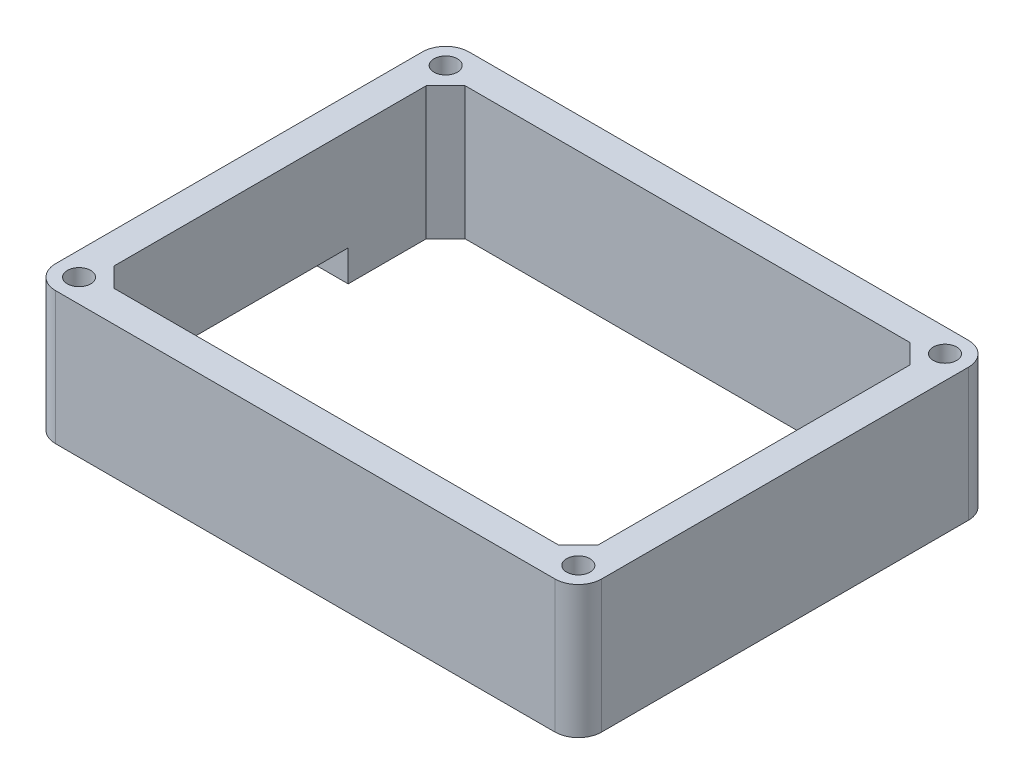
ISO-10303-21;
HEADER;
FILE_DESCRIPTION(('STEP AP214'),'2;1');
FILE_NAME('part.step','',(''),(''),'','','');
FILE_SCHEMA(('AUTOMOTIVE_DESIGN { 1 0 10303 214 1 1 1 1 }'));
ENDSEC;
DATA;
#1=APPLICATION_CONTEXT('core data for automotive mechanical design processes');
#2=APPLICATION_PROTOCOL_DEFINITION('international standard','automotive_design',2000,#1);
#3=PRODUCT_CONTEXT('',#1,'mechanical');
#4=PRODUCT('Part','Part','',(#3));
#5=PRODUCT_RELATED_PRODUCT_CATEGORY('part','',(#4));
#6=PRODUCT_DEFINITION_FORMATION('','',#4);
#7=PRODUCT_DEFINITION_CONTEXT('part definition',#1,'design');
#8=PRODUCT_DEFINITION('design','',#6,#7);
#9=PRODUCT_DEFINITION_SHAPE('','',#8);
#10=(LENGTH_UNIT() NAMED_UNIT(*) SI_UNIT(.MILLI.,.METRE.));
#11=(NAMED_UNIT(*) PLANE_ANGLE_UNIT() SI_UNIT($,.RADIAN.));
#12=(NAMED_UNIT(*) SI_UNIT($,.STERADIAN.) SOLID_ANGLE_UNIT());
#13=UNCERTAINTY_MEASURE_WITH_UNIT(LENGTH_MEASURE(1.E-05),#10,'distance_accuracy_value','');
#14=(GEOMETRIC_REPRESENTATION_CONTEXT(3) GLOBAL_UNCERTAINTY_ASSIGNED_CONTEXT((#13)) GLOBAL_UNIT_ASSIGNED_CONTEXT((#10,
#11,#12)) REPRESENTATION_CONTEXT('',''));
#15=CARTESIAN_POINT('',(0.,0.,0.));
#16=DIRECTION('',(0.,0.,1.));
#17=DIRECTION('',(1.,0.,0.));
#18=AXIS2_PLACEMENT_3D('',#15,#16,#17);
#19=CARTESIAN_POINT('',(-67.,17.,-2.99999999999999));
#20=DIRECTION('',(0.,-1.,0.));
#21=DIRECTION('',(0.,0.,-1.));
#22=AXIS2_PLACEMENT_3D('',#19,#20,#21);
#23=PLANE('',#22);
#24=CARTESIAN_POINT('',(-67.,17.,-2.99999999999999));
#25=DIRECTION('',(0.,1.,0.));
#26=DIRECTION('',(0.,0.,-1.));
#27=AXIS2_PLACEMENT_3D('',#24,#25,#26);
#28=CIRCLE('',#27,1.5);
#29=CARTESIAN_POINT('',(-67.,17.,-4.49999999999999));
#30=VERTEX_POINT('',#29);
#31=EDGE_CURVE('E269',#30,#30,#28,.T.);
#32=ORIENTED_EDGE('',*,*,#31,.F.);
#33=EDGE_LOOP('',(#32));
#34=FACE_BOUND('',#33,.T.);
#35=CARTESIAN_POINT('',(-3.,17.,-3.));
#36=DIRECTION('',(0.,1.,0.));
#37=DIRECTION('',(0.,0.,1.));
#38=AXIS2_PLACEMENT_3D('',#35,#36,#37);
#39=CIRCLE('',#38,1.5);
#40=CARTESIAN_POINT('',(-3.,17.,-1.5));
#41=VERTEX_POINT('',#40);
#42=EDGE_CURVE('E277',#41,#41,#39,.T.);
#43=ORIENTED_EDGE('',*,*,#42,.F.);
#44=EDGE_LOOP('',(#43));
#45=FACE_BOUND('',#44,.T.);
#46=CARTESIAN_POINT('',(-3.,17.,-50.));
#47=DIRECTION('',(0.,1.,0.));
#48=DIRECTION('',(0.,0.,-1.));
#49=AXIS2_PLACEMENT_3D('',#46,#47,#48);
#50=CIRCLE('',#49,1.5);
#51=CARTESIAN_POINT('',(-3.,17.,-51.5));
#52=VERTEX_POINT('',#51);
#53=EDGE_CURVE('E285',#52,#52,#50,.T.);
#54=ORIENTED_EDGE('',*,*,#53,.F.);
#55=EDGE_LOOP('',(#54));
#56=FACE_BOUND('',#55,.T.);
#57=CARTESIAN_POINT('',(-67.,17.,-50.));
#58=DIRECTION('',(0.,1.,0.));
#59=DIRECTION('',(0.,0.,1.));
#60=AXIS2_PLACEMENT_3D('',#57,#58,#59);
#61=CIRCLE('',#60,1.5);
#62=CARTESIAN_POINT('',(-67.,17.,-48.5));
#63=VERTEX_POINT('',#62);
#64=EDGE_CURVE('E293',#63,#63,#61,.T.);
#65=ORIENTED_EDGE('',*,*,#64,.F.);
#66=EDGE_LOOP('',(#65));
#67=FACE_BOUND('',#66,.T.);
#68=CARTESIAN_POINT('',(-67.,17.,-2.99999999999999));
#69=DIRECTION('',(0.,1.,0.));
#70=DIRECTION('',(0.,0.,-1.));
#71=AXIS2_PLACEMENT_3D('',#68,#69,#70);
#72=CIRCLE('',#71,3.);
#73=CARTESIAN_POINT('',(-70.,17.,-3.00000000000001));
#74=VERTEX_POINT('',#73);
#75=CARTESIAN_POINT('',(-67.,17.,0.));
#76=VERTEX_POINT('',#75);
#77=EDGE_CURVE('E301',#74,#76,#72,.T.);
#78=ORIENTED_EDGE('',*,*,#77,.T.);
#79=DIRECTION('',(1.,0.,0.));
#80=VECTOR('',#79,1.);
#81=CARTESIAN_POINT('',(-3.00000000000002,17.,0.));
#82=LINE('',#81,#80);
#83=CARTESIAN_POINT('',(-3.00000000000002,17.,0.));
#84=VERTEX_POINT('',#83);
#85=EDGE_CURVE('E305',#76,#84,#82,.T.);
#86=ORIENTED_EDGE('',*,*,#85,.T.);
#87=CARTESIAN_POINT('',(-3.,17.,-3.));
#88=DIRECTION('',(0.,1.,0.));
#89=DIRECTION('',(0.,0.,1.));
#90=AXIS2_PLACEMENT_3D('',#87,#88,#89);
#91=CIRCLE('',#90,3.);
#92=CARTESIAN_POINT('',(0.,17.,-3.00000000000002));
#93=VERTEX_POINT('',#92);
#94=EDGE_CURVE('E309',#84,#93,#91,.T.);
#95=ORIENTED_EDGE('',*,*,#94,.T.);
#96=DIRECTION('',(0.,0.,-1.));
#97=VECTOR('',#96,1.);
#98=CARTESIAN_POINT('',(0.,17.,-3.00000000000002));
#99=LINE('',#98,#97);
#100=CARTESIAN_POINT('',(0.,17.,-50.));
#101=VERTEX_POINT('',#100);
#102=EDGE_CURVE('E312',#93,#101,#99,.T.);
#103=ORIENTED_EDGE('',*,*,#102,.T.);
#104=CARTESIAN_POINT('',(-3.,17.,-50.));
#105=DIRECTION('',(0.,1.,0.));
#106=DIRECTION('',(0.,0.,1.));
#107=AXIS2_PLACEMENT_3D('',#104,#105,#106);
#108=CIRCLE('',#107,3.);
#109=CARTESIAN_POINT('',(-3.00000000000002,17.,-53.));
#110=VERTEX_POINT('',#109);
#111=EDGE_CURVE('E315',#101,#110,#108,.T.);
#112=ORIENTED_EDGE('',*,*,#111,.T.);
#113=DIRECTION('',(-1.,0.,0.));
#114=VECTOR('',#113,1.);
#115=CARTESIAN_POINT('',(-3.00000000000002,17.,-53.));
#116=LINE('',#115,#114);
#117=CARTESIAN_POINT('',(-67.,17.,-53.));
#118=VERTEX_POINT('',#117);
#119=EDGE_CURVE('E318',#110,#118,#116,.T.);
#120=ORIENTED_EDGE('',*,*,#119,.T.);
#121=CARTESIAN_POINT('',(-67.,17.,-50.));
#122=DIRECTION('',(0.,1.,0.));
#123=DIRECTION('',(0.,0.,1.));
#124=AXIS2_PLACEMENT_3D('',#121,#122,#123);
#125=CIRCLE('',#124,3.);
#126=CARTESIAN_POINT('',(-70.,17.,-50.));
#127=VERTEX_POINT('',#126);
#128=EDGE_CURVE('E321',#118,#127,#125,.T.);
#129=ORIENTED_EDGE('',*,*,#128,.T.);
#130=DIRECTION('',(0.,0.,1.));
#131=VECTOR('',#130,1.);
#132=CARTESIAN_POINT('',(-70.,17.,-3.00000000000001));
#133=LINE('',#132,#131);
#134=EDGE_CURVE('E324',#127,#74,#133,.T.);
#135=ORIENTED_EDGE('',*,*,#134,.T.);
#136=EDGE_LOOP('',(#78,#86,#95,#103,#112,#120,#129,#135));
#137=FACE_BOUND('',#136,.T.);
#138=DIRECTION('',(-1.,0.,0.));
#139=VECTOR('',#138,1.);
#140=CARTESIAN_POINT('',(-63.5,17.,-49.));
#141=LINE('',#140,#139);
#142=CARTESIAN_POINT('',(-6.5,17.,-49.));
#143=VERTEX_POINT('',#142);
#144=CARTESIAN_POINT('',(-63.5,17.,-49.));
#145=VERTEX_POINT('',#144);
#146=EDGE_CURVE('E242',#143,#145,#141,.T.);
#147=ORIENTED_EDGE('',*,*,#146,.F.);
#148=DIRECTION('',(-0.707106781186547,0.,-0.707106781186548));
#149=VECTOR('',#148,1.);
#150=CARTESIAN_POINT('',(-6.5,17.,-49.));
#151=LINE('',#150,#149);
#152=CARTESIAN_POINT('',(-4.00000000000001,17.,-46.5));
#153=VERTEX_POINT('',#152);
#154=EDGE_CURVE('E247',#153,#143,#151,.T.);
#155=ORIENTED_EDGE('',*,*,#154,.F.);
#156=DIRECTION('',(0.,0.,-1.));
#157=VECTOR('',#156,1.);
#158=CARTESIAN_POINT('',(-4.,17.,-46.5));
#159=LINE('',#158,#157);
#160=CARTESIAN_POINT('',(-4.,17.,-6.5));
#161=VERTEX_POINT('',#160);
#162=EDGE_CURVE('E411',#161,#153,#159,.T.);
#163=ORIENTED_EDGE('',*,*,#162,.F.);
#164=DIRECTION('',(0.707106781186548,0.,-0.707106781186548));
#165=VECTOR('',#164,1.);
#166=CARTESIAN_POINT('',(-6.5,17.,-4.));
#167=LINE('',#166,#165);
#168=CARTESIAN_POINT('',(-6.5,17.,-4.));
#169=VERTEX_POINT('',#168);
#170=EDGE_CURVE('E414',#169,#161,#167,.T.);
#171=ORIENTED_EDGE('',*,*,#170,.F.);
#172=DIRECTION('',(1.,0.,0.));
#173=VECTOR('',#172,1.);
#174=CARTESIAN_POINT('',(-63.5,17.,-4.));
#175=LINE('',#174,#173);
#176=CARTESIAN_POINT('',(-63.5,17.,-4.));
#177=VERTEX_POINT('',#176);
#178=EDGE_CURVE('E417',#177,#169,#175,.T.);
#179=ORIENTED_EDGE('',*,*,#178,.F.);
#180=DIRECTION('',(0.707106781186548,0.,0.707106781186547));
#181=VECTOR('',#180,1.);
#182=CARTESIAN_POINT('',(-66.,17.,-6.5));
#183=LINE('',#182,#181);
#184=CARTESIAN_POINT('',(-66.,17.,-6.5));
#185=VERTEX_POINT('',#184);
#186=EDGE_CURVE('E420',#185,#177,#183,.T.);
#187=ORIENTED_EDGE('',*,*,#186,.F.);
#188=DIRECTION('',(0.,0.,1.));
#189=VECTOR('',#188,1.);
#190=CARTESIAN_POINT('',(-66.,17.,-46.5));
#191=LINE('',#190,#189);
#192=CARTESIAN_POINT('',(-66.,17.,-46.5));
#193=VERTEX_POINT('',#192);
#194=EDGE_CURVE('E423',#193,#185,#191,.T.);
#195=ORIENTED_EDGE('',*,*,#194,.F.);
#196=DIRECTION('',(-0.707106781186547,0.,0.707106781186547));
#197=VECTOR('',#196,1.);
#198=CARTESIAN_POINT('',(-66.,17.,-46.5));
#199=LINE('',#198,#197);
#200=EDGE_CURVE('E426',#145,#193,#199,.T.);
#201=ORIENTED_EDGE('',*,*,#200,.F.);
#202=EDGE_LOOP('',(#147,#155,#163,#171,#179,#187,#195,#201));
#203=FACE_BOUND('',#202,.T.);
#204=ADVANCED_FACE('F45',(#34,#45,#56,#67,#137,#203),#23,.F.);
#205=CARTESIAN_POINT('',(-67.,0.,-2.99999999999999));
#206=DIRECTION('',(0.,-1.,0.));
#207=DIRECTION('',(0.,0.,-1.));
#208=AXIS2_PLACEMENT_3D('',#205,#206,#207);
#209=PLANE('',#208);
#210=DIRECTION('',(-1.,0.,0.));
#211=VECTOR('',#210,1.);
#212=CARTESIAN_POINT('',(-45.6039219456289,0.,-16.5));
#213=LINE('',#212,#211);
#214=CARTESIAN_POINT('',(-66.,0.,-16.5));
#215=VERTEX_POINT('',#214);
#216=CARTESIAN_POINT('',(-70.,0.,-16.5));
#217=VERTEX_POINT('',#216);
#218=EDGE_CURVE('E187',#215,#217,#213,.T.);
#219=ORIENTED_EDGE('',*,*,#218,.F.);
#220=DIRECTION('',(0.,0.,1.));
#221=VECTOR('',#220,1.);
#222=CARTESIAN_POINT('',(-66.,0.,-46.5));
#223=LINE('',#222,#221);
#224=CARTESIAN_POINT('',(-66.,0.,-6.5));
#225=VERTEX_POINT('',#224);
#226=EDGE_CURVE('E200',#215,#225,#223,.T.);
#227=ORIENTED_EDGE('',*,*,#226,.T.);
#228=DIRECTION('',(0.707106781186548,0.,0.707106781186547));
#229=VECTOR('',#228,1.);
#230=CARTESIAN_POINT('',(-66.,0.,-6.5));
#231=LINE('',#230,#229);
#232=CARTESIAN_POINT('',(-63.5,0.,-4.));
#233=VERTEX_POINT('',#232);
#234=EDGE_CURVE('E218',#225,#233,#231,.T.);
#235=ORIENTED_EDGE('',*,*,#234,.T.);
#236=DIRECTION('',(1.,0.,0.));
#237=VECTOR('',#236,1.);
#238=CARTESIAN_POINT('',(-63.5,0.,-4.));
#239=LINE('',#238,#237);
#240=CARTESIAN_POINT('',(-6.5,0.,-4.));
#241=VERTEX_POINT('',#240);
#242=EDGE_CURVE('E226',#233,#241,#239,.T.);
#243=ORIENTED_EDGE('',*,*,#242,.T.);
#244=DIRECTION('',(0.707106781186548,0.,-0.707106781186548));
#245=VECTOR('',#244,1.);
#246=CARTESIAN_POINT('',(-6.5,0.,-4.));
#247=LINE('',#246,#245);
#248=CARTESIAN_POINT('',(-4.,0.,-6.5));
#249=VERTEX_POINT('',#248);
#250=EDGE_CURVE('E230',#241,#249,#247,.T.);
#251=ORIENTED_EDGE('',*,*,#250,.T.);
#252=DIRECTION('',(0.,0.,-1.));
#253=VECTOR('',#252,1.);
#254=CARTESIAN_POINT('',(-4.,0.,-46.5));
#255=LINE('',#254,#253);
#256=CARTESIAN_POINT('',(-4.,0.,-46.5));
#257=VERTEX_POINT('',#256);
#258=EDGE_CURVE('E234',#249,#257,#255,.T.);
#259=ORIENTED_EDGE('',*,*,#258,.T.);
#260=DIRECTION('',(-0.707106781186547,0.,-0.707106781186548));
#261=VECTOR('',#260,1.);
#262=CARTESIAN_POINT('',(-6.5,0.,-49.));
#263=LINE('',#262,#261);
#264=CARTESIAN_POINT('',(-6.50000000000001,0.,-49.));
#265=VERTEX_POINT('',#264);
#266=EDGE_CURVE('E238',#257,#265,#263,.T.);
#267=ORIENTED_EDGE('',*,*,#266,.T.);
#268=DIRECTION('',(-1.,0.,0.));
#269=VECTOR('',#268,1.);
#270=CARTESIAN_POINT('',(-63.5,0.,-49.));
#271=LINE('',#270,#269);
#272=CARTESIAN_POINT('',(-63.5,0.,-49.));
#273=VERTEX_POINT('',#272);
#274=EDGE_CURVE('E220',#265,#273,#271,.T.);
#275=ORIENTED_EDGE('',*,*,#274,.T.);
#276=DIRECTION('',(-0.707106781186547,0.,0.707106781186547));
#277=VECTOR('',#276,1.);
#278=CARTESIAN_POINT('',(-66.,0.,-46.5));
#279=LINE('',#278,#277);
#280=CARTESIAN_POINT('',(-66.,0.,-46.5));
#281=VERTEX_POINT('',#280);
#282=EDGE_CURVE('E213',#273,#281,#279,.T.);
#283=ORIENTED_EDGE('',*,*,#282,.T.);
#284=CARTESIAN_POINT('',(-66.,0.,-36.5));
#285=VERTEX_POINT('',#284);
#286=EDGE_CURVE('E212',#281,#285,#223,.T.);
#287=ORIENTED_EDGE('',*,*,#286,.T.);
#288=DIRECTION('',(-1.,0.,0.));
#289=VECTOR('',#288,1.);
#290=CARTESIAN_POINT('',(-45.6039219456289,0.,-36.5));
#291=LINE('',#290,#289);
#292=CARTESIAN_POINT('',(-70.,0.,-36.5));
#293=VERTEX_POINT('',#292);
#294=EDGE_CURVE('E61',#285,#293,#291,.T.);
#295=ORIENTED_EDGE('',*,*,#294,.T.);
#296=DIRECTION('',(0.,0.,1.));
#297=VECTOR('',#296,1.);
#298=CARTESIAN_POINT('',(-70.,0.,-3.00000000000001));
#299=LINE('',#298,#297);
#300=CARTESIAN_POINT('',(-70.,0.,-50.));
#301=VERTEX_POINT('',#300);
#302=EDGE_CURVE('E306',#301,#293,#299,.T.);
#303=ORIENTED_EDGE('',*,*,#302,.F.);
#304=CARTESIAN_POINT('',(-67.,0.,-50.));
#305=DIRECTION('',(0.,1.,0.));
#306=DIRECTION('',(0.,0.,1.));
#307=AXIS2_PLACEMENT_3D('',#304,#305,#306);
#308=CIRCLE('',#307,3.);
#309=CARTESIAN_POINT('',(-67.,0.,-53.));
#310=VERTEX_POINT('',#309);
#311=EDGE_CURVE('E346',#310,#301,#308,.T.);
#312=ORIENTED_EDGE('',*,*,#311,.F.);
#313=DIRECTION('',(-1.,0.,0.));
#314=VECTOR('',#313,1.);
#315=CARTESIAN_POINT('',(-3.00000000000002,0.,-53.));
#316=LINE('',#315,#314);
#317=CARTESIAN_POINT('',(-3.00000000000002,0.,-53.));
#318=VERTEX_POINT('',#317);
#319=EDGE_CURVE('E343',#318,#310,#316,.T.);
#320=ORIENTED_EDGE('',*,*,#319,.F.);
#321=CARTESIAN_POINT('',(-3.,0.,-50.));
#322=DIRECTION('',(0.,1.,0.));
#323=DIRECTION('',(0.,0.,1.));
#324=AXIS2_PLACEMENT_3D('',#321,#322,#323);
#325=CIRCLE('',#324,3.);
#326=CARTESIAN_POINT('',(0.,0.,-50.));
#327=VERTEX_POINT('',#326);
#328=EDGE_CURVE('E340',#327,#318,#325,.T.);
#329=ORIENTED_EDGE('',*,*,#328,.F.);
#330=DIRECTION('',(0.,0.,-1.));
#331=VECTOR('',#330,1.);
#332=CARTESIAN_POINT('',(0.,0.,-3.00000000000002));
#333=LINE('',#332,#331);
#334=CARTESIAN_POINT('',(0.,0.,-3.00000000000002));
#335=VERTEX_POINT('',#334);
#336=EDGE_CURVE('E337',#335,#327,#333,.T.);
#337=ORIENTED_EDGE('',*,*,#336,.F.);
#338=CARTESIAN_POINT('',(-3.,0.,-3.));
#339=DIRECTION('',(0.,1.,0.));
#340=DIRECTION('',(0.,0.,1.));
#341=AXIS2_PLACEMENT_3D('',#338,#339,#340);
#342=CIRCLE('',#341,3.);
#343=CARTESIAN_POINT('',(-3.00000000000002,0.,0.));
#344=VERTEX_POINT('',#343);
#345=EDGE_CURVE('E334',#344,#335,#342,.T.);
#346=ORIENTED_EDGE('',*,*,#345,.F.);
#347=DIRECTION('',(1.,0.,0.));
#348=VECTOR('',#347,1.);
#349=CARTESIAN_POINT('',(-3.00000000000002,0.,0.));
#350=LINE('',#349,#348);
#351=CARTESIAN_POINT('',(-67.,0.,0.));
#352=VERTEX_POINT('',#351);
#353=EDGE_CURVE('E331',#352,#344,#350,.T.);
#354=ORIENTED_EDGE('',*,*,#353,.F.);
#355=CARTESIAN_POINT('',(-67.,0.,-2.99999999999999));
#356=DIRECTION('',(0.,1.,0.));
#357=DIRECTION('',(0.,0.,-1.));
#358=AXIS2_PLACEMENT_3D('',#355,#356,#357);
#359=CIRCLE('',#358,3.);
#360=CARTESIAN_POINT('',(-70.,0.,-3.00000000000001));
#361=VERTEX_POINT('',#360);
#362=EDGE_CURVE('E297',#361,#352,#359,.T.);
#363=ORIENTED_EDGE('',*,*,#362,.F.);
#364=EDGE_CURVE('E203',#217,#361,#299,.T.);
#365=ORIENTED_EDGE('',*,*,#364,.F.);
#366=EDGE_LOOP('',(#219,#227,#235,#243,#251,#259,#267,#275,#283,#287,#295,#303,#312,#320,#329,
#337,#346,#354,#363,#365));
#367=FACE_BOUND('',#366,.T.);
#368=CARTESIAN_POINT('',(-3.,0.,-3.));
#369=DIRECTION('',(0.,1.,0.));
#370=DIRECTION('',(0.,0.,1.));
#371=AXIS2_PLACEMENT_3D('',#368,#369,#370);
#372=CIRCLE('',#371,1.5);
#373=CARTESIAN_POINT('',(-3.,0.,-1.5));
#374=VERTEX_POINT('',#373);
#375=EDGE_CURVE('E273',#374,#374,#372,.T.);
#376=ORIENTED_EDGE('',*,*,#375,.T.);
#377=EDGE_LOOP('',(#376));
#378=FACE_BOUND('',#377,.T.);
#379=CARTESIAN_POINT('',(-67.,0.,-50.));
#380=DIRECTION('',(0.,1.,0.));
#381=DIRECTION('',(0.,0.,1.));
#382=AXIS2_PLACEMENT_3D('',#379,#380,#381);
#383=CIRCLE('',#382,1.5);
#384=CARTESIAN_POINT('',(-67.,0.,-48.5));
#385=VERTEX_POINT('',#384);
#386=EDGE_CURVE('E289',#385,#385,#383,.T.);
#387=ORIENTED_EDGE('',*,*,#386,.T.);
#388=EDGE_LOOP('',(#387));
#389=FACE_BOUND('',#388,.T.);
#390=CARTESIAN_POINT('',(-3.,0.,-50.));
#391=DIRECTION('',(0.,1.,0.));
#392=DIRECTION('',(0.,0.,-1.));
#393=AXIS2_PLACEMENT_3D('',#390,#391,#392);
#394=CIRCLE('',#393,1.5);
#395=CARTESIAN_POINT('',(-3.,0.,-51.5));
#396=VERTEX_POINT('',#395);
#397=EDGE_CURVE('E281',#396,#396,#394,.T.);
#398=ORIENTED_EDGE('',*,*,#397,.T.);
#399=EDGE_LOOP('',(#398));
#400=FACE_BOUND('',#399,.T.);
#401=CARTESIAN_POINT('',(-67.,0.,-2.99999999999999));
#402=DIRECTION('',(0.,1.,0.));
#403=DIRECTION('',(0.,0.,-1.));
#404=AXIS2_PLACEMENT_3D('',#401,#402,#403);
#405=CIRCLE('',#404,1.5);
#406=CARTESIAN_POINT('',(-67.,0.,-4.49999999999999));
#407=VERTEX_POINT('',#406);
#408=EDGE_CURVE('E268',#407,#407,#405,.T.);
#409=ORIENTED_EDGE('',*,*,#408,.T.);
#410=EDGE_LOOP('',(#409));
#411=FACE_BOUND('',#410,.T.);
#412=ADVANCED_FACE('F197',(#367,#378,#389,#400,#411),#209,.T.);
#413=CARTESIAN_POINT('',(-67.,17.,-2.99999999999999));
#414=DIRECTION('',(0.,-1.,0.));
#415=DIRECTION('',(0.,0.,-1.));
#416=AXIS2_PLACEMENT_3D('',#413,#414,#415);
#417=CYLINDRICAL_SURFACE('',#416,3.);
#418=ORIENTED_EDGE('',*,*,#362,.T.);
#419=DIRECTION('',(0.,-1.,0.));
#420=VECTOR('',#419,1.);
#421=CARTESIAN_POINT('',(-67.,17.,0.));
#422=LINE('',#421,#420);
#423=EDGE_CURVE('E11',#76,#352,#422,.T.);
#424=ORIENTED_EDGE('',*,*,#423,.F.);
#425=ORIENTED_EDGE('',*,*,#77,.F.);
#426=DIRECTION('',(0.,-1.,0.));
#427=VECTOR('',#426,1.);
#428=CARTESIAN_POINT('',(-70.,17.,-3.00000000000001));
#429=LINE('',#428,#427);
#430=EDGE_CURVE('E327',#74,#361,#429,.T.);
#431=ORIENTED_EDGE('',*,*,#430,.T.);
#432=EDGE_LOOP('',(#418,#424,#425,#431));
#433=FACE_BOUND('',#432,.T.);
#434=ADVANCED_FACE('F47',(#433),#417,.T.);
#435=CARTESIAN_POINT('',(-3.00000000000002,17.,0.));
#436=DIRECTION('',(0.,0.,-1.));
#437=DIRECTION('',(-1.,0.,0.));
#438=AXIS2_PLACEMENT_3D('',#435,#436,#437);
#439=PLANE('',#438);
#440=ORIENTED_EDGE('',*,*,#353,.T.);
#441=DIRECTION('',(0.,-1.,0.));
#442=VECTOR('',#441,1.);
#443=CARTESIAN_POINT('',(-3.00000000000002,17.,0.));
#444=LINE('',#443,#442);
#445=EDGE_CURVE('E54',#84,#344,#444,.T.);
#446=ORIENTED_EDGE('',*,*,#445,.F.);
#447=ORIENTED_EDGE('',*,*,#85,.F.);
#448=ORIENTED_EDGE('',*,*,#423,.T.);
#449=EDGE_LOOP('',(#440,#446,#447,#448));
#450=FACE_BOUND('',#449,.T.);
#451=ADVANCED_FACE('F400',(#450),#439,.F.);
#452=CARTESIAN_POINT('',(-3.,17.,-3.));
#453=DIRECTION('',(0.,-1.,0.));
#454=DIRECTION('',(0.,0.,-1.));
#455=AXIS2_PLACEMENT_3D('',#452,#453,#454);
#456=CYLINDRICAL_SURFACE('',#455,3.);
#457=ORIENTED_EDGE('',*,*,#345,.T.);
#458=DIRECTION('',(0.,-1.,0.));
#459=VECTOR('',#458,1.);
#460=CARTESIAN_POINT('',(0.,17.,-3.00000000000002));
#461=LINE('',#460,#459);
#462=EDGE_CURVE('E371',#93,#335,#461,.T.);
#463=ORIENTED_EDGE('',*,*,#462,.F.);
#464=ORIENTED_EDGE('',*,*,#94,.F.);
#465=ORIENTED_EDGE('',*,*,#445,.T.);
#466=EDGE_LOOP('',(#457,#463,#464,#465));
#467=FACE_BOUND('',#466,.T.);
#468=ADVANCED_FACE('F380',(#467),#456,.T.);
#469=CARTESIAN_POINT('',(0.,17.,-3.00000000000002));
#470=DIRECTION('',(-1.,0.,0.));
#471=DIRECTION('',(0.,0.,1.));
#472=AXIS2_PLACEMENT_3D('',#469,#470,#471);
#473=PLANE('',#472);
#474=ORIENTED_EDGE('',*,*,#336,.T.);
#475=DIRECTION('',(0.,-1.,0.));
#476=VECTOR('',#475,1.);
#477=CARTESIAN_POINT('',(0.,17.,-50.));
#478=LINE('',#477,#476);
#479=EDGE_CURVE('E367',#101,#327,#478,.T.);
#480=ORIENTED_EDGE('',*,*,#479,.F.);
#481=ORIENTED_EDGE('',*,*,#102,.F.);
#482=ORIENTED_EDGE('',*,*,#462,.T.);
#483=EDGE_LOOP('',(#474,#480,#481,#482));
#484=FACE_BOUND('',#483,.T.);
#485=ADVANCED_FACE('F388',(#484),#473,.F.);
#486=CARTESIAN_POINT('',(-3.,17.,-50.));
#487=DIRECTION('',(0.,-1.,0.));
#488=DIRECTION('',(0.,0.,-1.));
#489=AXIS2_PLACEMENT_3D('',#486,#487,#488);
#490=CYLINDRICAL_SURFACE('',#489,3.);
#491=ORIENTED_EDGE('',*,*,#328,.T.);
#492=DIRECTION('',(0.,-1.,0.));
#493=VECTOR('',#492,1.);
#494=CARTESIAN_POINT('',(-3.00000000000002,17.,-53.));
#495=LINE('',#494,#493);
#496=EDGE_CURVE('E363',#110,#318,#495,.T.);
#497=ORIENTED_EDGE('',*,*,#496,.F.);
#498=ORIENTED_EDGE('',*,*,#111,.F.);
#499=ORIENTED_EDGE('',*,*,#479,.T.);
#500=EDGE_LOOP('',(#491,#497,#498,#499));
#501=FACE_BOUND('',#500,.T.);
#502=ADVANCED_FACE('F392',(#501),#490,.T.);
#503=CARTESIAN_POINT('',(-3.00000000000002,17.,-53.));
#504=DIRECTION('',(0.,0.,1.));
#505=DIRECTION('',(1.,0.,0.));
#506=AXIS2_PLACEMENT_3D('',#503,#504,#505);
#507=PLANE('',#506);
#508=ORIENTED_EDGE('',*,*,#319,.T.);
#509=DIRECTION('',(0.,-1.,0.));
#510=VECTOR('',#509,1.);
#511=CARTESIAN_POINT('',(-67.,17.,-53.));
#512=LINE('',#511,#510);
#513=EDGE_CURVE('E359',#118,#310,#512,.T.);
#514=ORIENTED_EDGE('',*,*,#513,.F.);
#515=ORIENTED_EDGE('',*,*,#119,.F.);
#516=ORIENTED_EDGE('',*,*,#496,.T.);
#517=EDGE_LOOP('',(#508,#514,#515,#516));
#518=FACE_BOUND('',#517,.T.);
#519=ADVANCED_FACE('F490',(#518),#507,.F.);
#520=CARTESIAN_POINT('',(-67.,17.,-50.));
#521=DIRECTION('',(0.,-1.,0.));
#522=DIRECTION('',(0.,0.,-1.));
#523=AXIS2_PLACEMENT_3D('',#520,#521,#522);
#524=CYLINDRICAL_SURFACE('',#523,3.);
#525=ORIENTED_EDGE('',*,*,#311,.T.);
#526=DIRECTION('',(0.,-1.,0.));
#527=VECTOR('',#526,1.);
#528=CARTESIAN_POINT('',(-70.,17.,-50.));
#529=LINE('',#528,#527);
#530=EDGE_CURVE('E355',#127,#301,#529,.T.);
#531=ORIENTED_EDGE('',*,*,#530,.F.);
#532=ORIENTED_EDGE('',*,*,#128,.F.);
#533=ORIENTED_EDGE('',*,*,#513,.T.);
#534=EDGE_LOOP('',(#525,#531,#532,#533));
#535=FACE_BOUND('',#534,.T.);
#536=ADVANCED_FACE('F487',(#535),#524,.T.);
#537=CARTESIAN_POINT('',(-70.,17.,-3.00000000000001));
#538=DIRECTION('',(1.,0.,0.));
#539=DIRECTION('',(0.,0.,-1.));
#540=AXIS2_PLACEMENT_3D('',#537,#538,#539);
#541=PLANE('',#540);
#542=DIRECTION('',(0.,0.,-1.));
#543=VECTOR('',#542,1.);
#544=CARTESIAN_POINT('',(-70.,4.,-36.5));
#545=LINE('',#544,#543);
#546=CARTESIAN_POINT('',(-70.,4.,-16.5));
#547=VERTEX_POINT('',#546);
#548=CARTESIAN_POINT('',(-70.,4.,-36.5));
#549=VERTEX_POINT('',#548);
#550=EDGE_CURVE('E205',#547,#549,#545,.T.);
#551=ORIENTED_EDGE('',*,*,#550,.F.);
#552=DIRECTION('',(0.,1.,0.));
#553=VECTOR('',#552,1.);
#554=CARTESIAN_POINT('',(-70.,0.,-16.5));
#555=LINE('',#554,#553);
#556=EDGE_CURVE('E407',#217,#547,#555,.T.);
#557=ORIENTED_EDGE('',*,*,#556,.F.);
#558=ORIENTED_EDGE('',*,*,#364,.T.);
#559=ORIENTED_EDGE('',*,*,#430,.F.);
#560=ORIENTED_EDGE('',*,*,#134,.F.);
#561=ORIENTED_EDGE('',*,*,#530,.T.);
#562=ORIENTED_EDGE('',*,*,#302,.T.);
#563=DIRECTION('',(0.,-1.,0.));
#564=VECTOR('',#563,1.);
#565=CARTESIAN_POINT('',(-70.,0.,-36.5));
#566=LINE('',#565,#564);
#567=EDGE_CURVE('E450',#549,#293,#566,.T.);
#568=ORIENTED_EDGE('',*,*,#567,.F.);
#569=EDGE_LOOP('',(#551,#557,#558,#559,#560,#561,#562,#568));
#570=FACE_BOUND('',#569,.T.);
#571=ADVANCED_FACE('F406',(#570),#541,.F.);
#572=CARTESIAN_POINT('',(-67.,17.,-50.));
#573=DIRECTION('',(0.,-1.,0.));
#574=DIRECTION('',(0.,0.,-1.));
#575=AXIS2_PLACEMENT_3D('',#572,#573,#574);
#576=CYLINDRICAL_SURFACE('',#575,1.5);
#577=ORIENTED_EDGE('',*,*,#64,.T.);
#578=EDGE_LOOP('',(#577));
#579=FACE_BOUND('',#578,.T.);
#580=ORIENTED_EDGE('',*,*,#386,.F.);
#581=EDGE_LOOP('',(#580));
#582=FACE_BOUND('',#581,.T.);
#583=ADVANCED_FACE('F482',(#579,#582),#576,.F.);
#584=CARTESIAN_POINT('',(-3.,17.,-50.));
#585=DIRECTION('',(0.,-1.,0.));
#586=DIRECTION('',(0.,0.,-1.));
#587=AXIS2_PLACEMENT_3D('',#584,#585,#586);
#588=CYLINDRICAL_SURFACE('',#587,1.5);
#589=ORIENTED_EDGE('',*,*,#53,.T.);
#590=EDGE_LOOP('',(#589));
#591=FACE_BOUND('',#590,.T.);
#592=ORIENTED_EDGE('',*,*,#397,.F.);
#593=EDGE_LOOP('',(#592));
#594=FACE_BOUND('',#593,.T.);
#595=ADVANCED_FACE('F560',(#591,#594),#588,.F.);
#596=CARTESIAN_POINT('',(-3.,17.,-3.));
#597=DIRECTION('',(0.,-1.,0.));
#598=DIRECTION('',(0.,0.,-1.));
#599=AXIS2_PLACEMENT_3D('',#596,#597,#598);
#600=CYLINDRICAL_SURFACE('',#599,1.5);
#601=ORIENTED_EDGE('',*,*,#42,.T.);
#602=EDGE_LOOP('',(#601));
#603=FACE_BOUND('',#602,.T.);
#604=ORIENTED_EDGE('',*,*,#375,.F.);
#605=EDGE_LOOP('',(#604));
#606=FACE_BOUND('',#605,.T.);
#607=ADVANCED_FACE('F569',(#603,#606),#600,.F.);
#608=CARTESIAN_POINT('',(-67.,17.,-2.99999999999999));
#609=DIRECTION('',(0.,-1.,0.));
#610=DIRECTION('',(0.,0.,-1.));
#611=AXIS2_PLACEMENT_3D('',#608,#609,#610);
#612=CYLINDRICAL_SURFACE('',#611,1.5);
#613=ORIENTED_EDGE('',*,*,#31,.T.);
#614=EDGE_LOOP('',(#613));
#615=FACE_BOUND('',#614,.T.);
#616=ORIENTED_EDGE('',*,*,#408,.F.);
#617=EDGE_LOOP('',(#616));
#618=FACE_BOUND('',#617,.T.);
#619=ADVANCED_FACE('F578',(#615,#618),#612,.F.);
#620=CARTESIAN_POINT('',(-63.5,17.,-49.));
#621=DIRECTION('',(0.,0.,1.));
#622=DIRECTION('',(1.,0.,0.));
#623=AXIS2_PLACEMENT_3D('',#620,#621,#622);
#624=PLANE('',#623);
#625=ORIENTED_EDGE('',*,*,#274,.F.);
#626=DIRECTION('',(0.,-1.,0.));
#627=VECTOR('',#626,1.);
#628=CARTESIAN_POINT('',(-6.5,17.,-49.));
#629=LINE('',#628,#627);
#630=EDGE_CURVE('E243',#143,#265,#629,.T.);
#631=ORIENTED_EDGE('',*,*,#630,.F.);
#632=ORIENTED_EDGE('',*,*,#146,.T.);
#633=DIRECTION('',(0.,-1.,0.));
#634=VECTOR('',#633,1.);
#635=CARTESIAN_POINT('',(-63.5,17.,-49.));
#636=LINE('',#635,#634);
#637=EDGE_CURVE('E264',#145,#273,#636,.T.);
#638=ORIENTED_EDGE('',*,*,#637,.T.);
#639=EDGE_LOOP('',(#625,#631,#632,#638));
#640=FACE_BOUND('',#639,.T.);
#641=ADVANCED_FACE('F588',(#640),#624,.T.);
#642=CARTESIAN_POINT('',(-66.,17.,-46.5));
#643=DIRECTION('',(0.707106781186548,0.,0.707106781186548));
#644=DIRECTION('',(0.707106781186548,0.,-0.707106781186548));
#645=AXIS2_PLACEMENT_3D('',#642,#643,#644);
#646=PLANE('',#645);
#647=ORIENTED_EDGE('',*,*,#282,.F.);
#648=ORIENTED_EDGE('',*,*,#637,.F.);
#649=ORIENTED_EDGE('',*,*,#200,.T.);
#650=DIRECTION('',(0.,-1.,0.));
#651=VECTOR('',#650,1.);
#652=CARTESIAN_POINT('',(-66.,17.,-46.5));
#653=LINE('',#652,#651);
#654=EDGE_CURVE('E261',#193,#281,#653,.T.);
#655=ORIENTED_EDGE('',*,*,#654,.T.);
#656=EDGE_LOOP('',(#647,#648,#649,#655));
#657=FACE_BOUND('',#656,.T.);
#658=ADVANCED_FACE('F598',(#657),#646,.T.);
#659=CARTESIAN_POINT('',(-66.,17.,-46.5));
#660=DIRECTION('',(1.,0.,0.));
#661=DIRECTION('',(0.,0.,-1.));
#662=AXIS2_PLACEMENT_3D('',#659,#660,#661);
#663=PLANE('',#662);
#664=DIRECTION('',(0.,1.,0.));
#665=VECTOR('',#664,1.);
#666=CARTESIAN_POINT('',(-66.,0.,-16.5));
#667=LINE('',#666,#665);
#668=CARTESIAN_POINT('',(-66.,4.,-16.5));
#669=VERTEX_POINT('',#668);
#670=EDGE_CURVE('E183',#215,#669,#667,.T.);
#671=ORIENTED_EDGE('',*,*,#670,.T.);
#672=DIRECTION('',(0.,0.,-1.));
#673=VECTOR('',#672,1.);
#674=CARTESIAN_POINT('',(-66.,4.,-36.5));
#675=LINE('',#674,#673);
#676=CARTESIAN_POINT('',(-66.,4.,-36.5));
#677=VERTEX_POINT('',#676);
#678=EDGE_CURVE('E446',#669,#677,#675,.T.);
#679=ORIENTED_EDGE('',*,*,#678,.T.);
#680=DIRECTION('',(0.,-1.,0.));
#681=VECTOR('',#680,1.);
#682=CARTESIAN_POINT('',(-66.,0.,-36.5));
#683=LINE('',#682,#681);
#684=EDGE_CURVE('E439',#677,#285,#683,.T.);
#685=ORIENTED_EDGE('',*,*,#684,.T.);
#686=ORIENTED_EDGE('',*,*,#286,.F.);
#687=ORIENTED_EDGE('',*,*,#654,.F.);
#688=ORIENTED_EDGE('',*,*,#194,.T.);
#689=DIRECTION('',(0.,-1.,0.));
#690=VECTOR('',#689,1.);
#691=CARTESIAN_POINT('',(-66.,17.,-6.5));
#692=LINE('',#691,#690);
#693=EDGE_CURVE('E209',#185,#225,#692,.T.);
#694=ORIENTED_EDGE('',*,*,#693,.T.);
#695=ORIENTED_EDGE('',*,*,#226,.F.);
#696=EDGE_LOOP('',(#671,#679,#685,#686,#687,#688,#694,#695));
#697=FACE_BOUND('',#696,.T.);
#698=ADVANCED_FACE('F207',(#697),#663,.T.);
#699=CARTESIAN_POINT('',(-66.,17.,-6.5));
#700=DIRECTION('',(0.707106781186547,0.,-0.707106781186548));
#701=DIRECTION('',(-0.707106781186548,0.,-0.707106781186547));
#702=AXIS2_PLACEMENT_3D('',#699,#700,#701);
#703=PLANE('',#702);
#704=ORIENTED_EDGE('',*,*,#234,.F.);
#705=ORIENTED_EDGE('',*,*,#693,.F.);
#706=ORIENTED_EDGE('',*,*,#186,.T.);
#707=DIRECTION('',(0.,-1.,0.));
#708=VECTOR('',#707,1.);
#709=CARTESIAN_POINT('',(-63.5,17.,-4.));
#710=LINE('',#709,#708);
#711=EDGE_CURVE('E256',#177,#233,#710,.T.);
#712=ORIENTED_EDGE('',*,*,#711,.T.);
#713=EDGE_LOOP('',(#704,#705,#706,#712));
#714=FACE_BOUND('',#713,.T.);
#715=ADVANCED_FACE('F616',(#714),#703,.T.);
#716=CARTESIAN_POINT('',(-63.5,17.,-4.));
#717=DIRECTION('',(0.,0.,-1.));
#718=DIRECTION('',(-1.,0.,0.));
#719=AXIS2_PLACEMENT_3D('',#716,#717,#718);
#720=PLANE('',#719);
#721=ORIENTED_EDGE('',*,*,#242,.F.);
#722=ORIENTED_EDGE('',*,*,#711,.F.);
#723=ORIENTED_EDGE('',*,*,#178,.T.);
#724=DIRECTION('',(0.,-1.,0.));
#725=VECTOR('',#724,1.);
#726=CARTESIAN_POINT('',(-6.5,17.,-4.));
#727=LINE('',#726,#725);
#728=EDGE_CURVE('E253',#169,#241,#727,.T.);
#729=ORIENTED_EDGE('',*,*,#728,.T.);
#730=EDGE_LOOP('',(#721,#722,#723,#729));
#731=FACE_BOUND('',#730,.T.);
#732=ADVANCED_FACE('F625',(#731),#720,.T.);
#733=CARTESIAN_POINT('',(-6.5,17.,-4.));
#734=DIRECTION('',(-0.707106781186547,0.,-0.707106781186547));
#735=DIRECTION('',(-0.707106781186548,0.,0.707106781186548));
#736=AXIS2_PLACEMENT_3D('',#733,#734,#735);
#737=PLANE('',#736);
#738=ORIENTED_EDGE('',*,*,#250,.F.);
#739=ORIENTED_EDGE('',*,*,#728,.F.);
#740=ORIENTED_EDGE('',*,*,#170,.T.);
#741=DIRECTION('',(0.,-1.,0.));
#742=VECTOR('',#741,1.);
#743=CARTESIAN_POINT('',(-4.,17.,-6.5));
#744=LINE('',#743,#742);
#745=EDGE_CURVE('E250',#161,#249,#744,.T.);
#746=ORIENTED_EDGE('',*,*,#745,.T.);
#747=EDGE_LOOP('',(#738,#739,#740,#746));
#748=FACE_BOUND('',#747,.T.);
#749=ADVANCED_FACE('F635',(#748),#737,.T.);
#750=CARTESIAN_POINT('',(-4.,17.,-46.5));
#751=DIRECTION('',(-1.,0.,0.));
#752=DIRECTION('',(0.,0.,1.));
#753=AXIS2_PLACEMENT_3D('',#750,#751,#752);
#754=PLANE('',#753);
#755=ORIENTED_EDGE('',*,*,#258,.F.);
#756=ORIENTED_EDGE('',*,*,#745,.F.);
#757=ORIENTED_EDGE('',*,*,#162,.T.);
#758=DIRECTION('',(0.,-1.,0.));
#759=VECTOR('',#758,1.);
#760=CARTESIAN_POINT('',(-4.,17.,-46.5));
#761=LINE('',#760,#759);
#762=EDGE_CURVE('E69',#153,#257,#761,.T.);
#763=ORIENTED_EDGE('',*,*,#762,.T.);
#764=EDGE_LOOP('',(#755,#756,#757,#763));
#765=FACE_BOUND('',#764,.T.);
#766=ADVANCED_FACE('F645',(#765),#754,.T.);
#767=CARTESIAN_POINT('',(-6.5,17.,-49.));
#768=DIRECTION('',(-0.707106781186548,0.,0.707106781186547));
#769=DIRECTION('',(0.707106781186547,0.,0.707106781186548));
#770=AXIS2_PLACEMENT_3D('',#767,#768,#769);
#771=PLANE('',#770);
#772=ORIENTED_EDGE('',*,*,#266,.F.);
#773=ORIENTED_EDGE('',*,*,#762,.F.);
#774=ORIENTED_EDGE('',*,*,#154,.T.);
#775=ORIENTED_EDGE('',*,*,#630,.T.);
#776=EDGE_LOOP('',(#772,#773,#774,#775));
#777=FACE_BOUND('',#776,.T.);
#778=ADVANCED_FACE('F655',(#777),#771,.T.);
#779=CARTESIAN_POINT('',(-45.6039219456289,0.,-16.5));
#780=DIRECTION('',(0.,0.,1.));
#781=DIRECTION('',(1.,0.,0.));
#782=AXIS2_PLACEMENT_3D('',#779,#780,#781);
#783=PLANE('',#782);
#784=ORIENTED_EDGE('',*,*,#218,.T.);
#785=ORIENTED_EDGE('',*,*,#556,.T.);
#786=DIRECTION('',(-1.,0.,0.));
#787=VECTOR('',#786,1.);
#788=CARTESIAN_POINT('',(-45.6039219456289,4.,-16.5));
#789=LINE('',#788,#787);
#790=EDGE_CURVE('E189',#669,#547,#789,.T.);
#791=ORIENTED_EDGE('',*,*,#790,.F.);
#792=ORIENTED_EDGE('',*,*,#670,.F.);
#793=EDGE_LOOP('',(#784,#785,#791,#792));
#794=FACE_BOUND('',#793,.T.);
#795=ADVANCED_FACE('F185',(#794),#783,.F.);
#796=CARTESIAN_POINT('',(-45.6039219456289,4.,-36.5));
#797=DIRECTION('',(0.,1.,0.));
#798=DIRECTION('',(0.,0.,1.));
#799=AXIS2_PLACEMENT_3D('',#796,#797,#798);
#800=PLANE('',#799);
#801=ORIENTED_EDGE('',*,*,#790,.T.);
#802=ORIENTED_EDGE('',*,*,#550,.T.);
#803=DIRECTION('',(-1.,0.,0.));
#804=VECTOR('',#803,1.);
#805=CARTESIAN_POINT('',(-45.6039219456289,4.,-36.5));
#806=LINE('',#805,#804);
#807=EDGE_CURVE('E442',#677,#549,#806,.T.);
#808=ORIENTED_EDGE('',*,*,#807,.F.);
#809=ORIENTED_EDGE('',*,*,#678,.F.);
#810=EDGE_LOOP('',(#801,#802,#808,#809));
#811=FACE_BOUND('',#810,.T.);
#812=ADVANCED_FACE('F457',(#811),#800,.F.);
#813=CARTESIAN_POINT('',(-45.6039219456289,0.,-36.5));
#814=DIRECTION('',(0.,0.,-1.));
#815=DIRECTION('',(-1.,0.,0.));
#816=AXIS2_PLACEMENT_3D('',#813,#814,#815);
#817=PLANE('',#816);
#818=ORIENTED_EDGE('',*,*,#807,.T.);
#819=ORIENTED_EDGE('',*,*,#567,.T.);
#820=ORIENTED_EDGE('',*,*,#294,.F.);
#821=ORIENTED_EDGE('',*,*,#684,.F.);
#822=EDGE_LOOP('',(#818,#819,#820,#821));
#823=FACE_BOUND('',#822,.T.);
#824=ADVANCED_FACE('F464',(#823),#817,.F.);
#825=CLOSED_SHELL('',(#204,#412,#434,#451,#468,#485,#502,#519,#536,#571,#583,#595,#607,#619,
#641,#658,#698,#715,#732,#749,#766,#778,#795,#812,#824));
#826=MANIFOLD_SOLID_BREP('B2',#825);
#827=ADVANCED_BREP_SHAPE_REPRESENTATION('',(#18,#826),#14);
#828=SHAPE_DEFINITION_REPRESENTATION(#9,#827);
ENDSEC;
END-ISO-10303-21;
